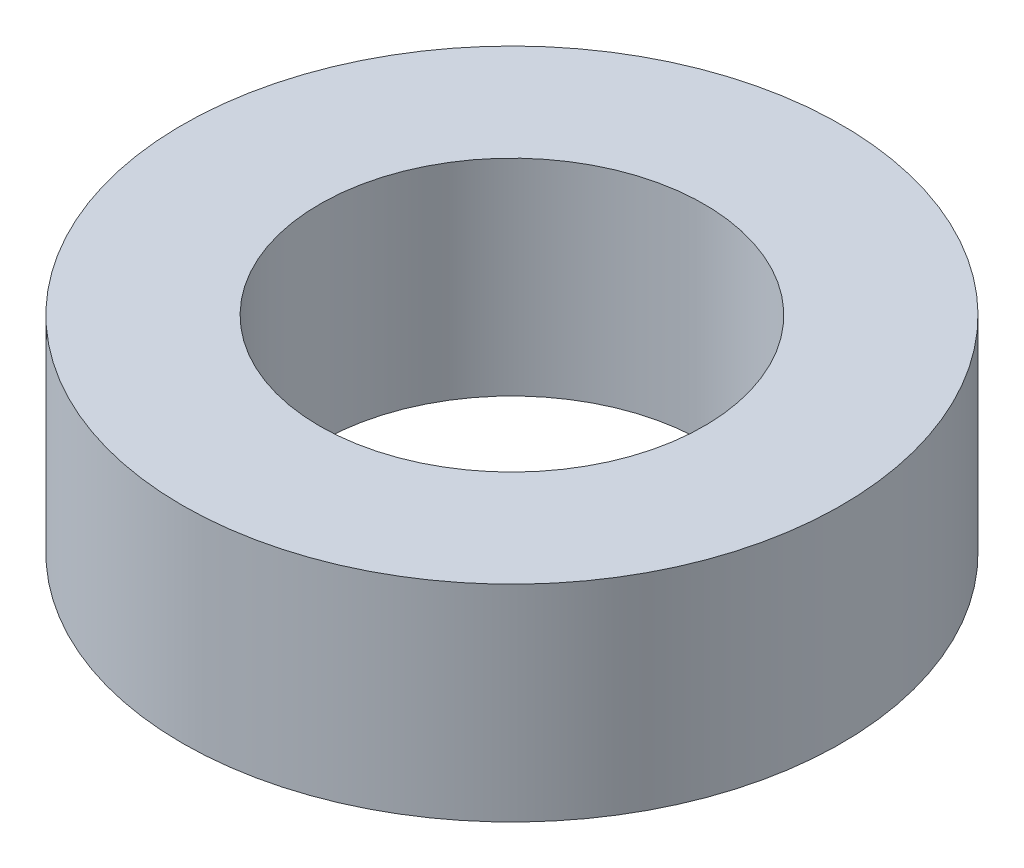
ISO-10303-21;
HEADER;
FILE_DESCRIPTION(('STEP AP214'),'2;1');
FILE_NAME('part.step','',(''),(''),'','','');
FILE_SCHEMA(('AUTOMOTIVE_DESIGN { 1 0 10303 214 1 1 1 1 }'));
ENDSEC;
DATA;
#1=APPLICATION_CONTEXT('core data for automotive mechanical design processes');
#2=APPLICATION_PROTOCOL_DEFINITION('international standard','automotive_design',2000,#1);
#3=PRODUCT_CONTEXT('',#1,'mechanical');
#4=PRODUCT('Part','Part','',(#3));
#5=PRODUCT_RELATED_PRODUCT_CATEGORY('part','',(#4));
#6=PRODUCT_DEFINITION_FORMATION('','',#4);
#7=PRODUCT_DEFINITION_CONTEXT('part definition',#1,'design');
#8=PRODUCT_DEFINITION('design','',#6,#7);
#9=PRODUCT_DEFINITION_SHAPE('','',#8);
#10=(LENGTH_UNIT() NAMED_UNIT(*) SI_UNIT(.MILLI.,.METRE.));
#11=(NAMED_UNIT(*) PLANE_ANGLE_UNIT() SI_UNIT($,.RADIAN.));
#12=(NAMED_UNIT(*) SI_UNIT($,.STERADIAN.) SOLID_ANGLE_UNIT());
#13=UNCERTAINTY_MEASURE_WITH_UNIT(LENGTH_MEASURE(1.E-05),#10,'distance_accuracy_value','');
#14=(GEOMETRIC_REPRESENTATION_CONTEXT(3) GLOBAL_UNCERTAINTY_ASSIGNED_CONTEXT((#13)) GLOBAL_UNIT_ASSIGNED_CONTEXT((#10,
#11,#12)) REPRESENTATION_CONTEXT('',''));
#15=CARTESIAN_POINT('',(0.,0.,0.));
#16=DIRECTION('',(0.,0.,1.));
#17=DIRECTION('',(1.,0.,0.));
#18=AXIS2_PLACEMENT_3D('',#15,#16,#17);
#19=CARTESIAN_POINT('',(0.,1.5,0.));
#20=DIRECTION('',(0.,-1.,0.));
#21=DIRECTION('',(0.,0.,-1.));
#22=AXIS2_PLACEMENT_3D('',#19,#20,#21);
#23=CYLINDRICAL_SURFACE('',#22,1.4);
#24=CARTESIAN_POINT('',(0.,1.5,1.4));
#25=CARTESIAN_POINT('',(0.,0.,1.4));
#26=(BOUNDED_CURVE() B_SPLINE_CURVE(1,(#24,#25),.UNSPECIFIED.,.F.,
.F.) B_SPLINE_CURVE_WITH_KNOTS((2,2),(0.,1.5),
.UNSPECIFIED.) CURVE() GEOMETRIC_REPRESENTATION_ITEM() RATIONAL_B_SPLINE_CURVE((1.,1.)) REPRESENTATION_ITEM(''));
#27=CARTESIAN_POINT('',(0.,1.5,1.4));
#28=VERTEX_POINT('',#27);
#29=CARTESIAN_POINT('',(0.,0.,1.4));
#30=VERTEX_POINT('',#29);
#31=EDGE_CURVE('E11',#28,#30,#26,.T.);
#32=ORIENTED_EDGE('',*,*,#31,.T.);
#33=CARTESIAN_POINT('',(0.,0.,0.));
#34=DIRECTION('',(0.,1.,0.));
#35=DIRECTION('',(0.,0.,1.));
#36=AXIS2_PLACEMENT_3D('',#33,#34,#35);
#37=CIRCLE('',#36,1.4);
#38=EDGE_CURVE('E58',#30,#30,#37,.T.);
#39=ORIENTED_EDGE('',*,*,#38,.F.);
#40=ORIENTED_EDGE('',*,*,#31,.F.);
#41=CARTESIAN_POINT('',(0.,1.5,0.));
#42=DIRECTION('',(0.,1.,0.));
#43=DIRECTION('',(0.,0.,1.));
#44=AXIS2_PLACEMENT_3D('',#41,#42,#43);
#45=CIRCLE('',#44,1.4);
#46=EDGE_CURVE('E57',#28,#28,#45,.T.);
#47=ORIENTED_EDGE('',*,*,#46,.T.);
#48=EDGE_LOOP('',(#32,#39,#40,#47));
#49=FACE_BOUND('',#48,.T.);
#50=ADVANCED_FACE('F17',(#49),#23,.F.);
#51=CARTESIAN_POINT('',(0.,1.5,0.));
#52=DIRECTION('',(0.,-1.,0.));
#53=DIRECTION('',(0.,0.,-1.));
#54=AXIS2_PLACEMENT_3D('',#51,#52,#53);
#55=CYLINDRICAL_SURFACE('',#54,2.4);
#56=CARTESIAN_POINT('',(0.,1.5,0.));
#57=DIRECTION('',(0.,1.,0.));
#58=DIRECTION('',(0.,0.,1.));
#59=AXIS2_PLACEMENT_3D('',#56,#57,#58);
#60=CIRCLE('',#59,2.4);
#61=CARTESIAN_POINT('',(0.,1.5,2.4));
#62=VERTEX_POINT('',#61);
#63=EDGE_CURVE('E74',#62,#62,#60,.T.);
#64=ORIENTED_EDGE('',*,*,#63,.F.);
#65=CARTESIAN_POINT('',(0.,1.5,2.4));
#66=CARTESIAN_POINT('',(0.,0.,2.4));
#67=(BOUNDED_CURVE() B_SPLINE_CURVE(1,(#65,#66),.UNSPECIFIED.,.F.,
.F.) B_SPLINE_CURVE_WITH_KNOTS((2,2),(0.,1.5),
.UNSPECIFIED.) CURVE() GEOMETRIC_REPRESENTATION_ITEM() RATIONAL_B_SPLINE_CURVE((1.,1.)) REPRESENTATION_ITEM(''));
#68=CARTESIAN_POINT('',(0.,0.,2.4));
#69=VERTEX_POINT('',#68);
#70=EDGE_CURVE('E21',#62,#69,#67,.T.);
#71=ORIENTED_EDGE('',*,*,#70,.T.);
#72=CARTESIAN_POINT('',(0.,0.,0.));
#73=DIRECTION('',(0.,1.,0.));
#74=DIRECTION('',(0.,0.,1.));
#75=AXIS2_PLACEMENT_3D('',#72,#73,#74);
#76=CIRCLE('',#75,2.4);
#77=EDGE_CURVE('E61',#69,#69,#76,.T.);
#78=ORIENTED_EDGE('',*,*,#77,.T.);
#79=ORIENTED_EDGE('',*,*,#70,.F.);
#80=EDGE_LOOP('',(#64,#71,#78,#79));
#81=FACE_BOUND('',#80,.T.);
#82=ADVANCED_FACE('F79',(#81),#55,.T.);
#83=CARTESIAN_POINT('',(0.,0.,0.));
#84=DIRECTION('',(0.,1.,0.));
#85=DIRECTION('',(1.,0.,0.));
#86=AXIS2_PLACEMENT_3D('',#83,#84,#85);
#87=PLANE('',#86);
#88=ORIENTED_EDGE('',*,*,#38,.T.);
#89=EDGE_LOOP('',(#88));
#90=FACE_BOUND('',#89,.T.);
#91=ORIENTED_EDGE('',*,*,#77,.F.);
#92=EDGE_LOOP('',(#91));
#93=FACE_BOUND('',#92,.T.);
#94=ADVANCED_FACE('F19',(#90,#93),#87,.F.);
#95=CARTESIAN_POINT('',(0.,1.5,0.));
#96=DIRECTION('',(0.,1.,0.));
#97=DIRECTION('',(1.,0.,0.));
#98=AXIS2_PLACEMENT_3D('',#95,#96,#97);
#99=PLANE('',#98);
#100=ORIENTED_EDGE('',*,*,#46,.F.);
#101=EDGE_LOOP('',(#100));
#102=FACE_BOUND('',#101,.T.);
#103=ORIENTED_EDGE('',*,*,#63,.T.);
#104=EDGE_LOOP('',(#103));
#105=FACE_BOUND('',#104,.T.);
#106=ADVANCED_FACE('F78',(#102,#105),#99,.T.);
#107=CLOSED_SHELL('',(#50,#82,#94,#106));
#108=MANIFOLD_SOLID_BREP('B1',#107);
#109=ADVANCED_BREP_SHAPE_REPRESENTATION('',(#18,#108),#14);
#110=SHAPE_DEFINITION_REPRESENTATION(#9,#109);
ENDSEC;
END-ISO-10303-21;
